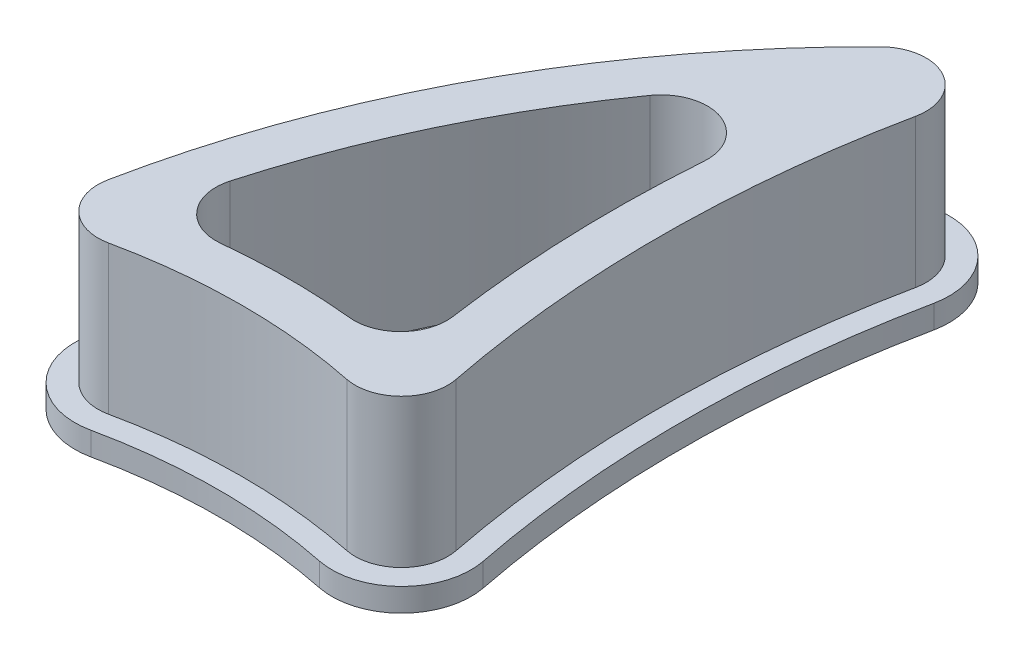
ISO-10303-21;
HEADER;
FILE_DESCRIPTION(('STEP AP214'),'2;1');
FILE_NAME('part.step','',(''),(''),'','','');
FILE_SCHEMA(('AUTOMOTIVE_DESIGN { 1 0 10303 214 1 1 1 1 }'));
ENDSEC;
DATA;
#1=APPLICATION_CONTEXT('core data for automotive mechanical design processes');
#2=APPLICATION_PROTOCOL_DEFINITION('international standard','automotive_design',2000,#1);
#3=PRODUCT_CONTEXT('',#1,'mechanical');
#4=PRODUCT('Part','Part','',(#3));
#5=PRODUCT_RELATED_PRODUCT_CATEGORY('part','',(#4));
#6=PRODUCT_DEFINITION_FORMATION('','',#4);
#7=PRODUCT_DEFINITION_CONTEXT('part definition',#1,'design');
#8=PRODUCT_DEFINITION('design','',#6,#7);
#9=PRODUCT_DEFINITION_SHAPE('','',#8);
#10=(LENGTH_UNIT() NAMED_UNIT(*) SI_UNIT(.MILLI.,.METRE.));
#11=(NAMED_UNIT(*) PLANE_ANGLE_UNIT() SI_UNIT($,.RADIAN.));
#12=(NAMED_UNIT(*) SI_UNIT($,.STERADIAN.) SOLID_ANGLE_UNIT());
#13=UNCERTAINTY_MEASURE_WITH_UNIT(LENGTH_MEASURE(1.E-05),#10,'distance_accuracy_value','');
#14=(GEOMETRIC_REPRESENTATION_CONTEXT(3) GLOBAL_UNCERTAINTY_ASSIGNED_CONTEXT((#13)) GLOBAL_UNIT_ASSIGNED_CONTEXT((#10,
#11,#12)) REPRESENTATION_CONTEXT('',''));
#15=CARTESIAN_POINT('',(0.,0.,0.));
#16=DIRECTION('',(0.,0.,1.));
#17=DIRECTION('',(1.,0.,0.));
#18=AXIS2_PLACEMENT_3D('',#15,#16,#17);
#19=CARTESIAN_POINT('',(-0.78145016287734,6.4,32.5967264977972));
#20=DIRECTION('',(0.,1.,0.));
#21=DIRECTION('',(0.,0.,1.));
#22=AXIS2_PLACEMENT_3D('',#19,#20,#21);
#23=PLANE('',#22);
#24=CARTESIAN_POINT('',(-3.60090629638444,6.4,19.3944287011548));
#25=DIRECTION('',(0.,1.,0.));
#26=DIRECTION('',(0.,0.,1.));
#27=AXIS2_PLACEMENT_3D('',#24,#25,#26);
#28=CIRCLE('',#27,2.);
#29=CARTESIAN_POINT('',(-5.56165783998686,6.4,19.0001529293139));
#30=VERTEX_POINT('',#29);
#31=CARTESIAN_POINT('',(-3.18320909142043,6.4,21.3503246710278));
#32=VERTEX_POINT('',#31);
#33=EDGE_CURVE('E156',#30,#32,#28,.T.);
#34=ORIENTED_EDGE('',*,*,#33,.T.);
#35=CARTESIAN_POINT('',(2.03800597062976,6.4,45.7990242944396));
#36=DIRECTION('',(0.,-1.,0.));
#37=DIRECTION('',(0.,0.,-1.));
#38=AXIS2_PLACEMENT_3D('',#35,#36,#37);
#39=CIRCLE('',#38,25.);
#40=CARTESIAN_POINT('',(7.04555103638997,6.4,21.3056682072396));
#41=VERTEX_POINT('',#40);
#42=EDGE_CURVE('E171',#32,#41,#39,.T.);
#43=ORIENTED_EDGE('',*,*,#42,.T.);
#44=CARTESIAN_POINT('',(7.44615464165079,6.4,19.3461997202636));
#45=DIRECTION('',(0.,1.,0.));
#46=DIRECTION('',(0.,0.,1.));
#47=AXIS2_PLACEMENT_3D('',#44,#45,#46);
#48=CIRCLE('',#47,2.);
#49=CARTESIAN_POINT('',(9.40832290349756,6.4,18.9590360440216));
#50=VERTEX_POINT('',#49);
#51=EDGE_CURVE('E110',#41,#50,#48,.T.);
#52=ORIENTED_EDGE('',*,*,#51,.T.);
#53=CARTESIAN_POINT('',(58.462529449667,6.4,9.27994413797231));
#54=DIRECTION('',(0.,-1.,0.));
#55=DIRECTION('',(0.,0.,-1.));
#56=AXIS2_PLACEMENT_3D('',#53,#54,#55);
#57=CIRCLE('',#56,50.);
#58=CARTESIAN_POINT('',(9.48913395704913,6.4,-0.800062505063111));
#59=VERTEX_POINT('',#58);
#60=EDGE_CURVE('E103',#50,#59,#57,.T.);
#61=ORIENTED_EDGE('',*,*,#60,.T.);
#62=CARTESIAN_POINT('',(7.53019813734441,6.4,-1.20326277078453));
#63=DIRECTION('',(0.,1.,0.));
#64=DIRECTION('',(0.,0.,-1.));
#65=AXIS2_PLACEMENT_3D('',#62,#63,#64);
#66=CIRCLE('',#65,2.);
#67=CARTESIAN_POINT('',(6.12600181542844,6.4,-2.62742311622238));
#68=VERTEX_POINT('',#67);
#69=EDGE_CURVE('E107',#59,#68,#66,.T.);
#70=ORIENTED_EDGE('',*,*,#69,.T.);
#71=CARTESIAN_POINT('',(35.614124575664,6.4,27.2799441379723));
#72=DIRECTION('',(0.,1.,0.));
#73=DIRECTION('',(0.,0.,1.));
#74=AXIS2_PLACEMENT_3D('',#71,#72,#73);
#75=CIRCLE('',#74,42.);
#76=EDGE_CURVE('E68',#68,#30,#75,.T.);
#77=ORIENTED_EDGE('',*,*,#76,.T.);
#78=EDGE_LOOP('',(#34,#43,#52,#61,#70,#77));
#79=FACE_BOUND('',#78,.T.);
#80=CARTESIAN_POINT('',(2.03800597062976,6.4,45.7990242944396));
#81=DIRECTION('',(0.,-1.,0.));
#82=DIRECTION('',(0.,0.,-1.));
#83=AXIS2_PLACEMENT_3D('',#80,#81,#82);
#84=CIRCLE('',#83,27.);
#85=CARTESIAN_POINT('',(-0.749525833280617,6.4,18.9433048581224));
#86=VERTEX_POINT('',#85);
#87=CARTESIAN_POINT('',(4.80529101021336,6.4,18.9412110269806));
#88=VERTEX_POINT('',#87);
#89=EDGE_CURVE('E214',#86,#88,#84,.T.);
#90=ORIENTED_EDGE('',*,*,#89,.F.);
#91=CARTESIAN_POINT('',(-0.956009670607316,6.4,16.9539923072841));
#92=DIRECTION('',(0.,1.,0.));
#93=DIRECTION('',(0.,0.,1.));
#94=AXIS2_PLACEMENT_3D('',#91,#92,#93);
#95=CIRCLE('',#94,2.);
#96=CARTESIAN_POINT('',(-2.8807535783058,6.4,16.4105211583005));
#97=VERTEX_POINT('',#96);
#98=EDGE_CURVE('E422',#97,#86,#95,.T.);
#99=ORIENTED_EDGE('',*,*,#98,.F.);
#100=CARTESIAN_POINT('',(35.614124575664,6.4,27.2799441379723));
#101=DIRECTION('',(0.,1.,0.));
#102=DIRECTION('',(0.,0.,1.));
#103=AXIS2_PLACEMENT_3D('',#100,#101,#102);
#104=CIRCLE('',#103,40.);
#105=CARTESIAN_POINT('',(2.97675623712936,6.4,4.15415360154271));
#106=VERTEX_POINT('',#105);
#107=EDGE_CURVE('E90',#106,#97,#104,.T.);
#108=ORIENTED_EDGE('',*,*,#107,.F.);
#109=CARTESIAN_POINT('',(4.6086246540561,6.4,5.3104431283642));
#110=DIRECTION('',(0.,1.,0.));
#111=DIRECTION('',(0.,0.,1.));
#112=AXIS2_PLACEMENT_3D('',#109,#110,#111);
#113=CIRCLE('',#112,2.);
#114=CARTESIAN_POINT('',(6.60321372056021,6.4,5.45746168427561));
#115=VERTEX_POINT('',#114);
#116=EDGE_CURVE('E227',#115,#106,#113,.T.);
#117=ORIENTED_EDGE('',*,*,#116,.F.);
#118=CARTESIAN_POINT('',(58.462529449667,6.4,9.27994413797231));
#119=DIRECTION('',(0.,-1.,0.));
#120=DIRECTION('',(0.,0.,-1.));
#121=AXIS2_PLACEMENT_3D('',#118,#119,#120);
#122=CIRCLE('',#121,52.);
#123=CARTESIAN_POINT('',(6.98998821175464,6.4,16.6676026649627));
#124=VERTEX_POINT('',#123);
#125=EDGE_CURVE('E213',#124,#115,#122,.T.);
#126=ORIENTED_EDGE('',*,*,#125,.F.);
#127=CARTESIAN_POINT('',(5.01027508721956,6.4,16.9517433775392));
#128=DIRECTION('',(0.,1.,0.));
#129=DIRECTION('',(0.,0.,1.));
#130=AXIS2_PLACEMENT_3D('',#127,#128,#129);
#131=CIRCLE('',#130,2.);
#132=EDGE_CURVE('E201',#88,#124,#131,.T.);
#133=ORIENTED_EDGE('',*,*,#132,.F.);
#134=EDGE_LOOP('',(#90,#99,#108,#117,#126,#133));
#135=FACE_BOUND('',#134,.T.);
#136=ADVANCED_FACE('F43',(#79,#135),#23,.T.);
#137=CARTESIAN_POINT('',(-3.60090629638444,6.4,19.3944287011548));
#138=DIRECTION('',(0.,-1.,0.));
#139=DIRECTION('',(0.,0.,-1.));
#140=AXIS2_PLACEMENT_3D('',#137,#138,#139);
#141=CYLINDRICAL_SURFACE('',#140,2.);
#142=CARTESIAN_POINT('',(-3.60090629638444,0.,19.3944287011548));
#143=DIRECTION('',(0.,1.,0.));
#144=DIRECTION('',(0.,0.,1.));
#145=AXIS2_PLACEMENT_3D('',#142,#143,#144);
#146=CIRCLE('',#145,2.);
#147=CARTESIAN_POINT('',(-5.56165783998686,0.,19.0001529293139));
#148=VERTEX_POINT('',#147);
#149=CARTESIAN_POINT('',(-3.18320909142043,0.,21.3503246710278));
#150=VERTEX_POINT('',#149);
#151=EDGE_CURVE('E137',#148,#150,#146,.T.);
#152=ORIENTED_EDGE('',*,*,#151,.T.);
#153=DIRECTION('',(0.,-1.,0.));
#154=VECTOR('',#153,1.);
#155=CARTESIAN_POINT('',(-3.18320909142043,6.4,21.3503246710278));
#156=LINE('',#155,#154);
#157=EDGE_CURVE('E11',#32,#150,#156,.T.);
#158=ORIENTED_EDGE('',*,*,#157,.F.);
#159=ORIENTED_EDGE('',*,*,#33,.F.);
#160=DIRECTION('',(0.,-1.,0.));
#161=VECTOR('',#160,1.);
#162=CARTESIAN_POINT('',(-5.56165783998686,6.4,19.0001529293139));
#163=LINE('',#162,#161);
#164=EDGE_CURVE('E133',#30,#148,#163,.T.);
#165=ORIENTED_EDGE('',*,*,#164,.T.);
#166=EDGE_LOOP('',(#152,#158,#159,#165));
#167=FACE_BOUND('',#166,.T.);
#168=ADVANCED_FACE('F45',(#167),#141,.T.);
#169=CARTESIAN_POINT('',(2.03800597062976,6.4,45.7990242944396));
#170=DIRECTION('',(0.,-1.,0.));
#171=DIRECTION('',(0.,0.,-1.));
#172=AXIS2_PLACEMENT_3D('',#169,#170,#171);
#173=CYLINDRICAL_SURFACE('',#172,25.);
#174=CARTESIAN_POINT('',(2.03800597062976,0.,45.7990242944396));
#175=DIRECTION('',(0.,-1.,0.));
#176=DIRECTION('',(0.,0.,-1.));
#177=AXIS2_PLACEMENT_3D('',#174,#175,#176);
#178=CIRCLE('',#177,25.);
#179=CARTESIAN_POINT('',(7.04555103638997,0.,21.3056682072396));
#180=VERTEX_POINT('',#179);
#181=EDGE_CURVE('E141',#150,#180,#178,.T.);
#182=ORIENTED_EDGE('',*,*,#181,.T.);
#183=DIRECTION('',(0.,-1.,0.));
#184=VECTOR('',#183,1.);
#185=CARTESIAN_POINT('',(7.04555103638997,6.4,21.3056682072396));
#186=LINE('',#185,#184);
#187=EDGE_CURVE('E52',#41,#180,#186,.T.);
#188=ORIENTED_EDGE('',*,*,#187,.F.);
#189=ORIENTED_EDGE('',*,*,#42,.F.);
#190=ORIENTED_EDGE('',*,*,#157,.T.);
#191=EDGE_LOOP('',(#182,#188,#189,#190));
#192=FACE_BOUND('',#191,.T.);
#193=ADVANCED_FACE('F170',(#192),#173,.F.);
#194=CARTESIAN_POINT('',(7.44615464165079,6.4,19.3461997202636));
#195=DIRECTION('',(0.,-1.,0.));
#196=DIRECTION('',(0.,0.,-1.));
#197=AXIS2_PLACEMENT_3D('',#194,#195,#196);
#198=CYLINDRICAL_SURFACE('',#197,2.);
#199=CARTESIAN_POINT('',(7.44615464165079,0.,19.3461997202636));
#200=DIRECTION('',(0.,1.,0.));
#201=DIRECTION('',(0.,0.,1.));
#202=AXIS2_PLACEMENT_3D('',#199,#200,#201);
#203=CIRCLE('',#202,2.);
#204=CARTESIAN_POINT('',(9.40832290349756,0.,18.9590360440216));
#205=VERTEX_POINT('',#204);
#206=EDGE_CURVE('E81',#180,#205,#203,.T.);
#207=ORIENTED_EDGE('',*,*,#206,.T.);
#208=DIRECTION('',(0.,-1.,0.));
#209=VECTOR('',#208,1.);
#210=CARTESIAN_POINT('',(9.40832290349756,6.4,18.9590360440216));
#211=LINE('',#210,#209);
#212=EDGE_CURVE('E125',#50,#205,#211,.T.);
#213=ORIENTED_EDGE('',*,*,#212,.F.);
#214=ORIENTED_EDGE('',*,*,#51,.F.);
#215=ORIENTED_EDGE('',*,*,#187,.T.);
#216=EDGE_LOOP('',(#207,#213,#214,#215));
#217=FACE_BOUND('',#216,.T.);
#218=ADVANCED_FACE('F167',(#217),#198,.T.);
#219=CARTESIAN_POINT('',(58.462529449667,6.4,9.27994413797231));
#220=DIRECTION('',(0.,-1.,0.));
#221=DIRECTION('',(0.,0.,-1.));
#222=AXIS2_PLACEMENT_3D('',#219,#220,#221);
#223=CYLINDRICAL_SURFACE('',#222,50.);
#224=CARTESIAN_POINT('',(58.462529449667,0.,9.27994413797231));
#225=DIRECTION('',(0.,-1.,0.));
#226=DIRECTION('',(0.,0.,-1.));
#227=AXIS2_PLACEMENT_3D('',#224,#225,#226);
#228=CIRCLE('',#227,50.);
#229=CARTESIAN_POINT('',(9.48913395704913,0.,-0.800062505063111));
#230=VERTEX_POINT('',#229);
#231=EDGE_CURVE('E121',#205,#230,#228,.T.);
#232=ORIENTED_EDGE('',*,*,#231,.T.);
#233=DIRECTION('',(0.,-1.,0.));
#234=VECTOR('',#233,1.);
#235=CARTESIAN_POINT('',(9.48913395704913,6.4,-0.800062505063111));
#236=LINE('',#235,#234);
#237=EDGE_CURVE('E118',#59,#230,#236,.T.);
#238=ORIENTED_EDGE('',*,*,#237,.F.);
#239=ORIENTED_EDGE('',*,*,#60,.F.);
#240=ORIENTED_EDGE('',*,*,#212,.T.);
#241=EDGE_LOOP('',(#232,#238,#239,#240));
#242=FACE_BOUND('',#241,.T.);
#243=ADVANCED_FACE('F119',(#242),#223,.F.);
#244=CARTESIAN_POINT('',(7.53019813734441,6.4,-1.20326277078453));
#245=DIRECTION('',(0.,-1.,0.));
#246=DIRECTION('',(0.,0.,-1.));
#247=AXIS2_PLACEMENT_3D('',#244,#245,#246);
#248=CYLINDRICAL_SURFACE('',#247,2.);
#249=CARTESIAN_POINT('',(7.53019813734441,0.,-1.20326277078453));
#250=DIRECTION('',(0.,1.,0.));
#251=DIRECTION('',(0.,0.,-1.));
#252=AXIS2_PLACEMENT_3D('',#249,#250,#251);
#253=CIRCLE('',#252,2.);
#254=CARTESIAN_POINT('',(6.12600181542844,0.,-2.62742311622238));
#255=VERTEX_POINT('',#254);
#256=EDGE_CURVE('E149',#230,#255,#253,.T.);
#257=ORIENTED_EDGE('',*,*,#256,.T.);
#258=DIRECTION('',(0.,-1.,0.));
#259=VECTOR('',#258,1.);
#260=CARTESIAN_POINT('',(6.12600181542844,6.4,-2.62742311622238));
#261=LINE('',#260,#259);
#262=EDGE_CURVE('E126',#68,#255,#261,.T.);
#263=ORIENTED_EDGE('',*,*,#262,.F.);
#264=ORIENTED_EDGE('',*,*,#69,.F.);
#265=ORIENTED_EDGE('',*,*,#237,.T.);
#266=EDGE_LOOP('',(#257,#263,#264,#265));
#267=FACE_BOUND('',#266,.T.);
#268=ADVANCED_FACE('F128',(#267),#248,.T.);
#269=CARTESIAN_POINT('',(35.614124575664,6.4,27.2799441379723));
#270=DIRECTION('',(0.,-1.,0.));
#271=DIRECTION('',(0.,0.,-1.));
#272=AXIS2_PLACEMENT_3D('',#269,#270,#271);
#273=CYLINDRICAL_SURFACE('',#272,42.);
#274=CARTESIAN_POINT('',(35.614124575664,0.,27.2799441379723));
#275=DIRECTION('',(0.,1.,0.));
#276=DIRECTION('',(0.,0.,1.));
#277=AXIS2_PLACEMENT_3D('',#274,#275,#276);
#278=CIRCLE('',#277,42.);
#279=EDGE_CURVE('E152',#255,#148,#278,.T.);
#280=ORIENTED_EDGE('',*,*,#279,.T.);
#281=ORIENTED_EDGE('',*,*,#164,.F.);
#282=ORIENTED_EDGE('',*,*,#76,.F.);
#283=ORIENTED_EDGE('',*,*,#262,.T.);
#284=EDGE_LOOP('',(#280,#281,#282,#283));
#285=FACE_BOUND('',#284,.T.);
#286=ADVANCED_FACE('F254',(#285),#273,.T.);
#287=CARTESIAN_POINT('',(-0.956009670607316,6.4,16.9539923072841));
#288=DIRECTION('',(0.,-1.,0.));
#289=DIRECTION('',(0.,0.,-1.));
#290=AXIS2_PLACEMENT_3D('',#287,#288,#289);
#291=CYLINDRICAL_SURFACE('',#290,2.);
#292=DIRECTION('',(0.,-1.,0.));
#293=VECTOR('',#292,1.);
#294=CARTESIAN_POINT('',(-0.749525833280617,6.4,18.9433048581224));
#295=LINE('',#294,#293);
#296=CARTESIAN_POINT('',(-0.749525833280617,-1.,18.9433048581224));
#297=VERTEX_POINT('',#296);
#298=EDGE_CURVE('E142',#86,#297,#295,.T.);
#299=ORIENTED_EDGE('',*,*,#298,.T.);
#300=CARTESIAN_POINT('',(-0.956009670607316,-1.,16.9539923072841));
#301=DIRECTION('',(0.,-1.,0.));
#302=DIRECTION('',(0.,0.,-1.));
#303=AXIS2_PLACEMENT_3D('',#300,#301,#302);
#304=CIRCLE('',#303,2.);
#305=CARTESIAN_POINT('',(-2.8807535783058,-1.,16.4105211583005));
#306=VERTEX_POINT('',#305);
#307=EDGE_CURVE('E350',#297,#306,#304,.T.);
#308=ORIENTED_EDGE('',*,*,#307,.T.);
#309=DIRECTION('',(0.,-1.,0.));
#310=VECTOR('',#309,1.);
#311=CARTESIAN_POINT('',(-2.8807535783058,6.4,16.4105211583005));
#312=LINE('',#311,#310);
#313=EDGE_CURVE('E236',#97,#306,#312,.T.);
#314=ORIENTED_EDGE('',*,*,#313,.F.);
#315=ORIENTED_EDGE('',*,*,#98,.T.);
#316=EDGE_LOOP('',(#299,#308,#314,#315));
#317=FACE_BOUND('',#316,.T.);
#318=ADVANCED_FACE('F256',(#317),#291,.F.);
#319=CARTESIAN_POINT('',(2.03800597062976,6.4,45.7990242944396));
#320=DIRECTION('',(0.,-1.,0.));
#321=DIRECTION('',(0.,0.,-1.));
#322=AXIS2_PLACEMENT_3D('',#319,#320,#321);
#323=CYLINDRICAL_SURFACE('',#322,27.);
#324=DIRECTION('',(0.,-1.,0.));
#325=VECTOR('',#324,1.);
#326=CARTESIAN_POINT('',(4.80529101021336,6.4,18.9412110269806));
#327=LINE('',#326,#325);
#328=CARTESIAN_POINT('',(4.80529101021336,-1.,18.9412110269806));
#329=VERTEX_POINT('',#328);
#330=EDGE_CURVE('E209',#88,#329,#327,.T.);
#331=ORIENTED_EDGE('',*,*,#330,.T.);
#332=CARTESIAN_POINT('',(2.03800597062976,-1.,45.7990242944396));
#333=DIRECTION('',(0.,1.,0.));
#334=DIRECTION('',(0.,0.,-1.));
#335=AXIS2_PLACEMENT_3D('',#332,#333,#334);
#336=CIRCLE('',#335,27.);
#337=EDGE_CURVE('E346',#329,#297,#336,.T.);
#338=ORIENTED_EDGE('',*,*,#337,.T.);
#339=ORIENTED_EDGE('',*,*,#298,.F.);
#340=ORIENTED_EDGE('',*,*,#89,.T.);
#341=EDGE_LOOP('',(#331,#338,#339,#340));
#342=FACE_BOUND('',#341,.T.);
#343=ADVANCED_FACE('F262',(#342),#323,.T.);
#344=CARTESIAN_POINT('',(5.01027508721956,6.4,16.9517433775392));
#345=DIRECTION('',(0.,-1.,0.));
#346=DIRECTION('',(0.,0.,-1.));
#347=AXIS2_PLACEMENT_3D('',#344,#345,#346);
#348=CYLINDRICAL_SURFACE('',#347,2.);
#349=DIRECTION('',(0.,-1.,0.));
#350=VECTOR('',#349,1.);
#351=CARTESIAN_POINT('',(6.98998821175464,6.4,16.6676026649627));
#352=LINE('',#351,#350);
#353=CARTESIAN_POINT('',(6.98998821175465,-1.,16.6676026649627));
#354=VERTEX_POINT('',#353);
#355=EDGE_CURVE('E206',#124,#354,#352,.T.);
#356=ORIENTED_EDGE('',*,*,#355,.T.);
#357=CARTESIAN_POINT('',(5.01027508721956,-1.,16.9517433775392));
#358=DIRECTION('',(0.,-1.,0.));
#359=DIRECTION('',(0.,0.,-1.));
#360=AXIS2_PLACEMENT_3D('',#357,#358,#359);
#361=CIRCLE('',#360,2.);
#362=EDGE_CURVE('E340',#354,#329,#361,.T.);
#363=ORIENTED_EDGE('',*,*,#362,.T.);
#364=ORIENTED_EDGE('',*,*,#330,.F.);
#365=ORIENTED_EDGE('',*,*,#132,.T.);
#366=EDGE_LOOP('',(#356,#363,#364,#365));
#367=FACE_BOUND('',#366,.T.);
#368=ADVANCED_FACE('F203',(#367),#348,.F.);
#369=CARTESIAN_POINT('',(58.462529449667,6.4,9.27994413797231));
#370=DIRECTION('',(0.,-1.,0.));
#371=DIRECTION('',(0.,0.,-1.));
#372=AXIS2_PLACEMENT_3D('',#369,#370,#371);
#373=CYLINDRICAL_SURFACE('',#372,52.);
#374=DIRECTION('',(0.,-1.,0.));
#375=VECTOR('',#374,1.);
#376=CARTESIAN_POINT('',(6.60321372056021,6.4,5.45746168427561));
#377=LINE('',#376,#375);
#378=CARTESIAN_POINT('',(6.60321372056021,-1.,5.45746168427561));
#379=VERTEX_POINT('',#378);
#380=EDGE_CURVE('E224',#115,#379,#377,.T.);
#381=ORIENTED_EDGE('',*,*,#380,.T.);
#382=CARTESIAN_POINT('',(58.462529449667,-1.,9.27994413797231));
#383=DIRECTION('',(0.,1.,0.));
#384=DIRECTION('',(0.,0.,-1.));
#385=AXIS2_PLACEMENT_3D('',#382,#383,#384);
#386=CIRCLE('',#385,52.);
#387=EDGE_CURVE('E221',#379,#354,#386,.T.);
#388=ORIENTED_EDGE('',*,*,#387,.T.);
#389=ORIENTED_EDGE('',*,*,#355,.F.);
#390=ORIENTED_EDGE('',*,*,#125,.T.);
#391=EDGE_LOOP('',(#381,#388,#389,#390));
#392=FACE_BOUND('',#391,.T.);
#393=ADVANCED_FACE('F218',(#392),#373,.T.);
#394=CARTESIAN_POINT('',(4.6086246540561,6.4,5.3104431283642));
#395=DIRECTION('',(0.,-1.,0.));
#396=DIRECTION('',(0.,0.,-1.));
#397=AXIS2_PLACEMENT_3D('',#394,#395,#396);
#398=CYLINDRICAL_SURFACE('',#397,2.);
#399=DIRECTION('',(0.,-1.,0.));
#400=VECTOR('',#399,1.);
#401=CARTESIAN_POINT('',(2.97675623712936,6.4,4.15415360154271));
#402=LINE('',#401,#400);
#403=CARTESIAN_POINT('',(2.97675623712937,-1.,4.15415360154271));
#404=VERTEX_POINT('',#403);
#405=EDGE_CURVE('E59',#106,#404,#402,.T.);
#406=ORIENTED_EDGE('',*,*,#405,.T.);
#407=CARTESIAN_POINT('',(4.6086246540561,-1.,5.3104431283642));
#408=DIRECTION('',(0.,-1.,0.));
#409=DIRECTION('',(0.,0.,-1.));
#410=AXIS2_PLACEMENT_3D('',#407,#408,#409);
#411=CIRCLE('',#410,2.00000000000001);
#412=EDGE_CURVE('E330',#404,#379,#411,.T.);
#413=ORIENTED_EDGE('',*,*,#412,.T.);
#414=ORIENTED_EDGE('',*,*,#380,.F.);
#415=ORIENTED_EDGE('',*,*,#116,.T.);
#416=EDGE_LOOP('',(#406,#413,#414,#415));
#417=FACE_BOUND('',#416,.T.);
#418=ADVANCED_FACE('F279',(#417),#398,.F.);
#419=CARTESIAN_POINT('',(35.614124575664,6.4,27.2799441379723));
#420=DIRECTION('',(0.,-1.,0.));
#421=DIRECTION('',(0.,0.,-1.));
#422=AXIS2_PLACEMENT_3D('',#419,#420,#421);
#423=CYLINDRICAL_SURFACE('',#422,40.);
#424=ORIENTED_EDGE('',*,*,#313,.T.);
#425=CARTESIAN_POINT('',(35.614124575664,-1.,27.2799441379723));
#426=DIRECTION('',(0.,-1.,0.));
#427=DIRECTION('',(0.,0.,-1.));
#428=AXIS2_PLACEMENT_3D('',#425,#426,#427);
#429=CIRCLE('',#428,40.);
#430=EDGE_CURVE('E333',#306,#404,#429,.T.);
#431=ORIENTED_EDGE('',*,*,#430,.T.);
#432=ORIENTED_EDGE('',*,*,#405,.F.);
#433=ORIENTED_EDGE('',*,*,#107,.T.);
#434=EDGE_LOOP('',(#424,#431,#432,#433));
#435=FACE_BOUND('',#434,.T.);
#436=ADVANCED_FACE('F282',(#435),#423,.F.);
#437=CARTESIAN_POINT('',(21.5721613565042,0.,13.0383406835939));
#438=DIRECTION('',(0.,-1.,0.));
#439=DIRECTION('',(0.,0.,-1.));
#440=AXIS2_PLACEMENT_3D('',#437,#438,#439);
#441=PLANE('',#440);
#442=CARTESIAN_POINT('',(35.614124575664,0.,27.2799441379723));
#443=DIRECTION('',(0.,-1.,0.));
#444=DIRECTION('',(0.,0.,-1.));
#445=AXIS2_PLACEMENT_3D('',#442,#443,#444);
#446=CIRCLE('',#445,43.);
#447=CARTESIAN_POINT('',(-6.54203361178807,0.,18.8030150433935));
#448=VERTEX_POINT('',#447);
#449=CARTESIAN_POINT('',(5.42390365447045,0.,-3.3395032889413));
#450=VERTEX_POINT('',#449);
#451=EDGE_CURVE('E354',#448,#450,#446,.T.);
#452=ORIENTED_EDGE('',*,*,#451,.F.);
#453=CARTESIAN_POINT('',(-3.60090629638444,0.,19.3944287011548));
#454=DIRECTION('',(0.,-1.,0.));
#455=DIRECTION('',(0.,0.,-1.));
#456=AXIS2_PLACEMENT_3D('',#453,#454,#455);
#457=CIRCLE('',#456,2.99999999999999);
#458=CARTESIAN_POINT('',(-2.97436048893842,0.,22.3282726559642));
#459=VERTEX_POINT('',#458);
#460=EDGE_CURVE('E358',#459,#448,#457,.T.);
#461=ORIENTED_EDGE('',*,*,#460,.F.);
#462=CARTESIAN_POINT('',(2.03800597062976,0.,45.7990242944396));
#463=DIRECTION('',(0.,1.,0.));
#464=DIRECTION('',(0.,0.,-1.));
#465=AXIS2_PLACEMENT_3D('',#462,#463,#464);
#466=CIRCLE('',#465,24.);
#467=CARTESIAN_POINT('',(6.84524923375956,0.,22.2854024507276));
#468=VERTEX_POINT('',#467);
#469=EDGE_CURVE('E392',#468,#459,#466,.T.);
#470=ORIENTED_EDGE('',*,*,#469,.F.);
#471=CARTESIAN_POINT('',(7.44615464165079,0.,19.3461997202636));
#472=DIRECTION('',(0.,-1.,0.));
#473=DIRECTION('',(0.,0.,-1.));
#474=AXIS2_PLACEMENT_3D('',#471,#472,#473);
#475=CIRCLE('',#474,3.);
#476=CARTESIAN_POINT('',(10.3894070344209,0.,18.7654542059006));
#477=VERTEX_POINT('',#476);
#478=EDGE_CURVE('E388',#477,#468,#475,.T.);
#479=ORIENTED_EDGE('',*,*,#478,.F.);
#480=CARTESIAN_POINT('',(58.462529449667,0.,9.27994413797231));
#481=DIRECTION('',(0.,1.,0.));
#482=DIRECTION('',(0.,0.,-1.));
#483=AXIS2_PLACEMENT_3D('',#480,#481,#482);
#484=CIRCLE('',#483,49.);
#485=CARTESIAN_POINT('',(10.4686018669015,0.,-0.598462372202401));
#486=VERTEX_POINT('',#485);
#487=EDGE_CURVE('E384',#486,#477,#484,.T.);
#488=ORIENTED_EDGE('',*,*,#487,.F.);
#489=CARTESIAN_POINT('',(7.53019813734441,0.,-1.20326277078453));
#490=DIRECTION('',(0.,-1.,0.));
#491=DIRECTION('',(0.,0.,-1.));
#492=AXIS2_PLACEMENT_3D('',#489,#490,#491);
#493=CIRCLE('',#492,3.);
#494=EDGE_CURVE('E380',#450,#486,#493,.T.);
#495=ORIENTED_EDGE('',*,*,#494,.F.);
#496=EDGE_LOOP('',(#452,#461,#470,#479,#488,#495));
#497=FACE_BOUND('',#496,.T.);
#498=ORIENTED_EDGE('',*,*,#151,.F.);
#499=ORIENTED_EDGE('',*,*,#279,.F.);
#500=ORIENTED_EDGE('',*,*,#256,.F.);
#501=ORIENTED_EDGE('',*,*,#231,.F.);
#502=ORIENTED_EDGE('',*,*,#206,.F.);
#503=ORIENTED_EDGE('',*,*,#181,.F.);
#504=EDGE_LOOP('',(#498,#499,#500,#501,#502,#503));
#505=FACE_BOUND('',#504,.T.);
#506=ADVANCED_FACE('F175',(#497,#505),#441,.F.);
#507=CARTESIAN_POINT('',(21.5721613565042,-1.,13.0383406835939));
#508=DIRECTION('',(0.,-1.,0.));
#509=DIRECTION('',(0.,0.,-1.));
#510=AXIS2_PLACEMENT_3D('',#507,#508,#509);
#511=PLANE('',#510);
#512=CARTESIAN_POINT('',(35.614124575664,-1.,27.2799441379723));
#513=DIRECTION('',(0.,-1.,0.));
#514=DIRECTION('',(0.,0.,-1.));
#515=AXIS2_PLACEMENT_3D('',#512,#513,#514);
#516=CIRCLE('',#515,43.);
#517=CARTESIAN_POINT('',(-6.54203361178807,-1.,18.8030150433935));
#518=VERTEX_POINT('',#517);
#519=CARTESIAN_POINT('',(5.42390365447045,-1.,-3.3395032889413));
#520=VERTEX_POINT('',#519);
#521=EDGE_CURVE('E324',#518,#520,#516,.T.);
#522=ORIENTED_EDGE('',*,*,#521,.T.);
#523=CARTESIAN_POINT('',(7.53019813734441,-1.,-1.20326277078453));
#524=DIRECTION('',(0.,-1.,0.));
#525=DIRECTION('',(0.,0.,-1.));
#526=AXIS2_PLACEMENT_3D('',#523,#524,#525);
#527=CIRCLE('',#526,3.);
#528=CARTESIAN_POINT('',(10.4686018669015,-1.,-0.598462372202401));
#529=VERTEX_POINT('',#528);
#530=EDGE_CURVE('E357',#520,#529,#527,.T.);
#531=ORIENTED_EDGE('',*,*,#530,.T.);
#532=CARTESIAN_POINT('',(58.462529449667,-1.,9.27994413797231));
#533=DIRECTION('',(0.,1.,0.));
#534=DIRECTION('',(0.,0.,-1.));
#535=AXIS2_PLACEMENT_3D('',#532,#533,#534);
#536=CIRCLE('',#535,49.);
#537=CARTESIAN_POINT('',(10.3894070344209,-1.,18.7654542059006));
#538=VERTEX_POINT('',#537);
#539=EDGE_CURVE('E361',#529,#538,#536,.T.);
#540=ORIENTED_EDGE('',*,*,#539,.T.);
#541=CARTESIAN_POINT('',(7.44615464165079,-1.,19.3461997202636));
#542=DIRECTION('',(0.,-1.,0.));
#543=DIRECTION('',(0.,0.,-1.));
#544=AXIS2_PLACEMENT_3D('',#541,#542,#543);
#545=CIRCLE('',#544,3.);
#546=CARTESIAN_POINT('',(6.84524923375956,-1.,22.2854024507276));
#547=VERTEX_POINT('',#546);
#548=EDGE_CURVE('E365',#538,#547,#545,.T.);
#549=ORIENTED_EDGE('',*,*,#548,.T.);
#550=CARTESIAN_POINT('',(2.03800597062976,-1.,45.7990242944396));
#551=DIRECTION('',(0.,1.,0.));
#552=DIRECTION('',(0.,0.,-1.));
#553=AXIS2_PLACEMENT_3D('',#550,#551,#552);
#554=CIRCLE('',#553,24.);
#555=CARTESIAN_POINT('',(-2.97436048893842,-1.,22.3282726559642));
#556=VERTEX_POINT('',#555);
#557=EDGE_CURVE('E369',#547,#556,#554,.T.);
#558=ORIENTED_EDGE('',*,*,#557,.T.);
#559=CARTESIAN_POINT('',(-3.60090629638444,-1.,19.3944287011548));
#560=DIRECTION('',(0.,-1.,0.));
#561=DIRECTION('',(0.,0.,-1.));
#562=AXIS2_PLACEMENT_3D('',#559,#560,#561);
#563=CIRCLE('',#562,2.99999999999999);
#564=EDGE_CURVE('E373',#556,#518,#563,.T.);
#565=ORIENTED_EDGE('',*,*,#564,.T.);
#566=EDGE_LOOP('',(#522,#531,#540,#549,#558,#565));
#567=FACE_BOUND('',#566,.T.);
#568=ORIENTED_EDGE('',*,*,#412,.F.);
#569=ORIENTED_EDGE('',*,*,#430,.F.);
#570=ORIENTED_EDGE('',*,*,#307,.F.);
#571=ORIENTED_EDGE('',*,*,#337,.F.);
#572=ORIENTED_EDGE('',*,*,#362,.F.);
#573=ORIENTED_EDGE('',*,*,#387,.F.);
#574=EDGE_LOOP('',(#568,#569,#570,#571,#572,#573));
#575=FACE_BOUND('',#574,.T.);
#576=ADVANCED_FACE('F290',(#567,#575),#511,.T.);
#577=CARTESIAN_POINT('',(35.614124575664,-1.,27.2799441379723));
#578=DIRECTION('',(0.,1.,0.));
#579=DIRECTION('',(0.,0.,1.));
#580=AXIS2_PLACEMENT_3D('',#577,#578,#579);
#581=CYLINDRICAL_SURFACE('',#580,43.);
#582=ORIENTED_EDGE('',*,*,#451,.T.);
#583=DIRECTION('',(0.,1.,0.));
#584=VECTOR('',#583,1.);
#585=CARTESIAN_POINT('',(5.42390365447045,-1.,-3.3395032889413));
#586=LINE('',#585,#584);
#587=EDGE_CURVE('E418',#520,#450,#586,.T.);
#588=ORIENTED_EDGE('',*,*,#587,.F.);
#589=ORIENTED_EDGE('',*,*,#521,.F.);
#590=DIRECTION('',(0.,1.,0.));
#591=VECTOR('',#590,1.);
#592=CARTESIAN_POINT('',(-6.54203361178807,-1.,18.8030150433935));
#593=LINE('',#592,#591);
#594=EDGE_CURVE('E376',#518,#448,#593,.T.);
#595=ORIENTED_EDGE('',*,*,#594,.T.);
#596=EDGE_LOOP('',(#582,#588,#589,#595));
#597=FACE_BOUND('',#596,.T.);
#598=ADVANCED_FACE('F286',(#597),#581,.T.);
#599=CARTESIAN_POINT('',(7.53019813734441,-1.,-1.20326277078453));
#600=DIRECTION('',(0.,1.,0.));
#601=DIRECTION('',(0.,0.,1.));
#602=AXIS2_PLACEMENT_3D('',#599,#600,#601);
#603=CYLINDRICAL_SURFACE('',#602,3.);
#604=ORIENTED_EDGE('',*,*,#494,.T.);
#605=DIRECTION('',(0.,1.,0.));
#606=VECTOR('',#605,1.);
#607=CARTESIAN_POINT('',(10.4686018669015,-1.,-0.598462372202401));
#608=LINE('',#607,#606);
#609=EDGE_CURVE('E414',#529,#486,#608,.T.);
#610=ORIENTED_EDGE('',*,*,#609,.F.);
#611=ORIENTED_EDGE('',*,*,#530,.F.);
#612=ORIENTED_EDGE('',*,*,#587,.T.);
#613=EDGE_LOOP('',(#604,#610,#611,#612));
#614=FACE_BOUND('',#613,.T.);
#615=ADVANCED_FACE('F289',(#614),#603,.T.);
#616=CARTESIAN_POINT('',(58.462529449667,-1.,9.27994413797231));
#617=DIRECTION('',(0.,1.,0.));
#618=DIRECTION('',(0.,0.,1.));
#619=AXIS2_PLACEMENT_3D('',#616,#617,#618);
#620=CYLINDRICAL_SURFACE('',#619,49.);
#621=ORIENTED_EDGE('',*,*,#487,.T.);
#622=DIRECTION('',(0.,1.,0.));
#623=VECTOR('',#622,1.);
#624=CARTESIAN_POINT('',(10.3894070344209,-1.,18.7654542059006));
#625=LINE('',#624,#623);
#626=EDGE_CURVE('E410',#538,#477,#625,.T.);
#627=ORIENTED_EDGE('',*,*,#626,.F.);
#628=ORIENTED_EDGE('',*,*,#539,.F.);
#629=ORIENTED_EDGE('',*,*,#609,.T.);
#630=EDGE_LOOP('',(#621,#627,#628,#629));
#631=FACE_BOUND('',#630,.T.);
#632=ADVANCED_FACE('F294',(#631),#620,.F.);
#633=CARTESIAN_POINT('',(7.44615464165079,-1.,19.3461997202636));
#634=DIRECTION('',(0.,1.,0.));
#635=DIRECTION('',(0.,0.,1.));
#636=AXIS2_PLACEMENT_3D('',#633,#634,#635);
#637=CYLINDRICAL_SURFACE('',#636,3.);
#638=ORIENTED_EDGE('',*,*,#478,.T.);
#639=DIRECTION('',(0.,1.,0.));
#640=VECTOR('',#639,1.);
#641=CARTESIAN_POINT('',(6.84524923375956,-1.,22.2854024507276));
#642=LINE('',#641,#640);
#643=EDGE_CURVE('E406',#547,#468,#642,.T.);
#644=ORIENTED_EDGE('',*,*,#643,.F.);
#645=ORIENTED_EDGE('',*,*,#548,.F.);
#646=ORIENTED_EDGE('',*,*,#626,.T.);
#647=EDGE_LOOP('',(#638,#644,#645,#646));
#648=FACE_BOUND('',#647,.T.);
#649=ADVANCED_FACE('F298',(#648),#637,.T.);
#650=CARTESIAN_POINT('',(2.03800597062976,-1.,45.7990242944396));
#651=DIRECTION('',(0.,1.,0.));
#652=DIRECTION('',(0.,0.,1.));
#653=AXIS2_PLACEMENT_3D('',#650,#651,#652);
#654=CYLINDRICAL_SURFACE('',#653,24.);
#655=ORIENTED_EDGE('',*,*,#469,.T.);
#656=DIRECTION('',(0.,1.,0.));
#657=VECTOR('',#656,1.);
#658=CARTESIAN_POINT('',(-2.97436048893842,-1.,22.3282726559642));
#659=LINE('',#658,#657);
#660=EDGE_CURVE('E402',#556,#459,#659,.T.);
#661=ORIENTED_EDGE('',*,*,#660,.F.);
#662=ORIENTED_EDGE('',*,*,#557,.F.);
#663=ORIENTED_EDGE('',*,*,#643,.T.);
#664=EDGE_LOOP('',(#655,#661,#662,#663));
#665=FACE_BOUND('',#664,.T.);
#666=ADVANCED_FACE('F302',(#665),#654,.F.);
#667=CARTESIAN_POINT('',(-3.60090629638444,-1.,19.3944287011548));
#668=DIRECTION('',(0.,1.,0.));
#669=DIRECTION('',(0.,0.,1.));
#670=AXIS2_PLACEMENT_3D('',#667,#668,#669);
#671=CYLINDRICAL_SURFACE('',#670,2.99999999999999);
#672=ORIENTED_EDGE('',*,*,#460,.T.);
#673=ORIENTED_EDGE('',*,*,#594,.F.);
#674=ORIENTED_EDGE('',*,*,#564,.F.);
#675=ORIENTED_EDGE('',*,*,#660,.T.);
#676=EDGE_LOOP('',(#672,#673,#674,#675));
#677=FACE_BOUND('',#676,.T.);
#678=ADVANCED_FACE('F306',(#677),#671,.T.);
#679=CLOSED_SHELL('',(#136,#168,#193,#218,#243,#268,#286,#318,#343,#368,#393,#418,#436,#506,
#576,#598,#615,#632,#649,#666,#678));
#680=MANIFOLD_SOLID_BREP('B2',#679);
#681=ADVANCED_BREP_SHAPE_REPRESENTATION('',(#18,#680),#14);
#682=SHAPE_DEFINITION_REPRESENTATION(#9,#681);
ENDSEC;
END-ISO-10303-21;
